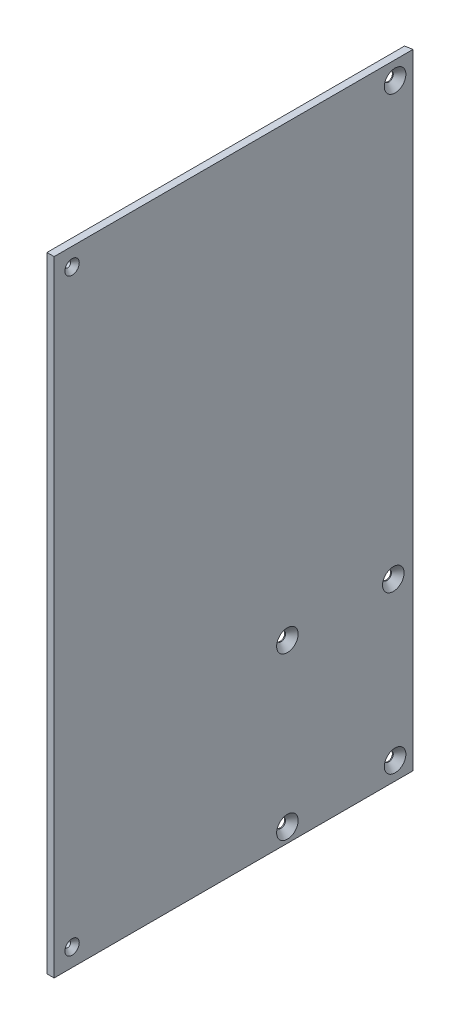
ISO-10303-21;
HEADER;
FILE_DESCRIPTION(('STEP AP214'),'2;1');
FILE_NAME('part.step','',(''),(''),'','','');
FILE_SCHEMA(('AUTOMOTIVE_DESIGN { 1 0 10303 214 1 1 1 1 }'));
ENDSEC;
DATA;
#1=APPLICATION_CONTEXT('core data for automotive mechanical design processes');
#2=APPLICATION_PROTOCOL_DEFINITION('international standard','automotive_design',2000,#1);
#3=PRODUCT_CONTEXT('',#1,'mechanical');
#4=PRODUCT('Part','Part','',(#3));
#5=PRODUCT_RELATED_PRODUCT_CATEGORY('part','',(#4));
#6=PRODUCT_DEFINITION_FORMATION('','',#4);
#7=PRODUCT_DEFINITION_CONTEXT('part definition',#1,'design');
#8=PRODUCT_DEFINITION('design','',#6,#7);
#9=PRODUCT_DEFINITION_SHAPE('','',#8);
#10=(LENGTH_UNIT() NAMED_UNIT(*) SI_UNIT(.MILLI.,.METRE.));
#11=(NAMED_UNIT(*) PLANE_ANGLE_UNIT() SI_UNIT($,.RADIAN.));
#12=(NAMED_UNIT(*) SI_UNIT($,.STERADIAN.) SOLID_ANGLE_UNIT());
#13=UNCERTAINTY_MEASURE_WITH_UNIT(LENGTH_MEASURE(1.E-05),#10,'distance_accuracy_value','');
#14=(GEOMETRIC_REPRESENTATION_CONTEXT(3) GLOBAL_UNCERTAINTY_ASSIGNED_CONTEXT((#13)) GLOBAL_UNIT_ASSIGNED_CONTEXT((#10,
#11,#12)) REPRESENTATION_CONTEXT('',''));
#15=CARTESIAN_POINT('',(0.,0.,0.));
#16=DIRECTION('',(0.,0.,1.));
#17=DIRECTION('',(1.,0.,0.));
#18=AXIS2_PLACEMENT_3D('',#15,#16,#17);
#19=CARTESIAN_POINT('',(82.9035305009001,0.,0.));
#20=DIRECTION('',(-1.,0.,0.));
#21=DIRECTION('',(0.,0.,1.));
#22=AXIS2_PLACEMENT_3D('',#19,#20,#21);
#23=PLANE('',#22);
#24=CARTESIAN_POINT('',(82.9035305009001,52.,44.9332950003212));
#25=DIRECTION('',(1.,0.,0.));
#26=DIRECTION('',(0.,0.,-1.));
#27=AXIS2_PLACEMENT_3D('',#24,#25,#26);
#28=CIRCLE('',#27,3.);
#29=CARTESIAN_POINT('',(82.9035305009001,52.,41.9332950003212));
#30=VERTEX_POINT('',#29);
#31=EDGE_CURVE('E155',#30,#30,#28,.T.);
#32=ORIENTED_EDGE('',*,*,#31,.F.);
#33=EDGE_LOOP('',(#32));
#34=FACE_BOUND('',#33,.T.);
#35=CARTESIAN_POINT('',(82.9035305009001,7.,74.4332950003211));
#36=DIRECTION('',(1.,0.,0.));
#37=DIRECTION('',(0.,0.,-1.));
#38=AXIS2_PLACEMENT_3D('',#35,#36,#37);
#39=CIRCLE('',#38,3.);
#40=CARTESIAN_POINT('',(82.9035305009001,7.,71.4332950003211));
#41=VERTEX_POINT('',#40);
#42=EDGE_CURVE('E146',#41,#41,#39,.T.);
#43=ORIENTED_EDGE('',*,*,#42,.F.);
#44=EDGE_LOOP('',(#43));
#45=FACE_BOUND('',#44,.T.);
#46=CARTESIAN_POINT('',(82.9035305009001,172.,44.4332950003212));
#47=DIRECTION('',(1.,0.,0.));
#48=DIRECTION('',(0.,0.,-1.));
#49=AXIS2_PLACEMENT_3D('',#46,#47,#48);
#50=CIRCLE('',#49,3.);
#51=CARTESIAN_POINT('',(82.9035305009001,172.,41.4332950003211));
#52=VERTEX_POINT('',#51);
#53=EDGE_CURVE('E141',#52,#52,#50,.T.);
#54=ORIENTED_EDGE('',*,*,#53,.F.);
#55=EDGE_LOOP('',(#54));
#56=FACE_BOUND('',#55,.T.);
#57=CARTESIAN_POINT('',(82.9035305009001,8.,44.4332950003212));
#58=DIRECTION('',(1.,0.,0.));
#59=DIRECTION('',(0.,0.,-1.));
#60=AXIS2_PLACEMENT_3D('',#57,#58,#59);
#61=CIRCLE('',#60,3.);
#62=CARTESIAN_POINT('',(82.9035305009001,8.,41.4332950003212));
#63=VERTEX_POINT('',#62);
#64=EDGE_CURVE('E136',#63,#63,#61,.T.);
#65=ORIENTED_EDGE('',*,*,#64,.F.);
#66=EDGE_LOOP('',(#65));
#67=FACE_BOUND('',#66,.T.);
#68=CARTESIAN_POINT('',(82.9035305009001,8.,134.399262949457));
#69=DIRECTION('',(1.,0.,0.));
#70=DIRECTION('',(0.,0.,-1.));
#71=AXIS2_PLACEMENT_3D('',#68,#69,#70);
#72=CIRCLE('',#71,2.);
#73=CARTESIAN_POINT('',(82.9035305009001,8.,132.399262949457));
#74=VERTEX_POINT('',#73);
#75=EDGE_CURVE('E124',#74,#74,#72,.T.);
#76=ORIENTED_EDGE('',*,*,#75,.F.);
#77=EDGE_LOOP('',(#76));
#78=FACE_BOUND('',#77,.T.);
#79=DIRECTION('',(0.,1.,0.));
#80=VECTOR('',#79,1.);
#81=CARTESIAN_POINT('',(82.9035305009001,177.,39.4332950003212));
#82=LINE('',#81,#80);
#83=CARTESIAN_POINT('',(82.9035305009001,3.,39.4332950003212));
#84=VERTEX_POINT('',#83);
#85=CARTESIAN_POINT('',(82.9035305009001,177.,39.4332950003212));
#86=VERTEX_POINT('',#85);
#87=EDGE_CURVE('E200',#84,#86,#82,.T.);
#88=ORIENTED_EDGE('',*,*,#87,.T.);
#89=DIRECTION('',(0.,0.,1.));
#90=VECTOR('',#89,1.);
#91=CARTESIAN_POINT('',(82.9035305009001,177.,39.4332950003212));
#92=LINE('',#91,#90);
#93=CARTESIAN_POINT('',(82.9035305009001,177.,139.399262949457));
#94=VERTEX_POINT('',#93);
#95=EDGE_CURVE('E98',#86,#94,#92,.T.);
#96=ORIENTED_EDGE('',*,*,#95,.T.);
#97=DIRECTION('',(0.,-1.,0.));
#98=VECTOR('',#97,1.);
#99=CARTESIAN_POINT('',(82.9035305009001,177.,139.399262949457));
#100=LINE('',#99,#98);
#101=CARTESIAN_POINT('',(82.9035305009001,3.,139.399262949457));
#102=VERTEX_POINT('',#101);
#103=EDGE_CURVE('E87',#94,#102,#100,.T.);
#104=ORIENTED_EDGE('',*,*,#103,.T.);
#105=DIRECTION('',(0.,0.,-1.));
#106=VECTOR('',#105,1.);
#107=CARTESIAN_POINT('',(82.9035305009001,3.,39.4332950003212));
#108=LINE('',#107,#106);
#109=EDGE_CURVE('E97',#102,#84,#108,.T.);
#110=ORIENTED_EDGE('',*,*,#109,.T.);
#111=EDGE_LOOP('',(#88,#96,#104,#110));
#112=FACE_BOUND('',#111,.T.);
#113=CARTESIAN_POINT('',(82.9035305009001,172.,134.399262949457));
#114=DIRECTION('',(1.,0.,0.));
#115=DIRECTION('',(0.,0.,-1.));
#116=AXIS2_PLACEMENT_3D('',#113,#114,#115);
#117=CIRCLE('',#116,2.);
#118=CARTESIAN_POINT('',(82.9035305009001,172.,132.399262949457));
#119=VERTEX_POINT('',#118);
#120=EDGE_CURVE('E130',#119,#119,#117,.T.);
#121=ORIENTED_EDGE('',*,*,#120,.F.);
#122=EDGE_LOOP('',(#121));
#123=FACE_BOUND('',#122,.T.);
#124=CARTESIAN_POINT('',(82.9035305009001,52.,74.4332950003211));
#125=DIRECTION('',(1.,0.,0.));
#126=DIRECTION('',(0.,0.,-1.));
#127=AXIS2_PLACEMENT_3D('',#124,#125,#126);
#128=CIRCLE('',#127,3.);
#129=CARTESIAN_POINT('',(82.9035305009001,52.,71.4332950003211));
#130=VERTEX_POINT('',#129);
#131=EDGE_CURVE('E422',#130,#130,#128,.T.);
#132=ORIENTED_EDGE('',*,*,#131,.F.);
#133=EDGE_LOOP('',(#132));
#134=FACE_BOUND('',#133,.T.);
#135=ADVANCED_FACE('F51',(#34,#45,#56,#67,#78,#112,#123,#134),#23,.F.);
#136=CARTESIAN_POINT('',(80.9035305009001,3.,39.4332950003212));
#137=DIRECTION('',(0.,-1.,0.));
#138=DIRECTION('',(0.,0.,-1.));
#139=AXIS2_PLACEMENT_3D('',#136,#137,#138);
#140=PLANE('',#139);
#141=DIRECTION('',(-0.983268675216208,0.,0.18216122622162));
#142=VECTOR('',#141,1.);
#143=CARTESIAN_POINT('',(80.9035305009001,3.,39.8038167728806));
#144=LINE('',#143,#142);
#145=CARTESIAN_POINT('',(80.9035305009001,3.,39.8038167728806));
#146=VERTEX_POINT('',#145);
#147=EDGE_CURVE('E104',#84,#146,#144,.T.);
#148=ORIENTED_EDGE('',*,*,#147,.F.);
#149=ORIENTED_EDGE('',*,*,#109,.F.);
#150=DIRECTION('',(1.,0.,0.));
#151=VECTOR('',#150,1.);
#152=CARTESIAN_POINT('',(80.9035305009001,3.,139.399262949457));
#153=LINE('',#152,#151);
#154=CARTESIAN_POINT('',(80.9035305009001,3.,139.399262949457));
#155=VERTEX_POINT('',#154);
#156=EDGE_CURVE('E11',#155,#102,#153,.T.);
#157=ORIENTED_EDGE('',*,*,#156,.F.);
#158=DIRECTION('',(0.,0.,-1.));
#159=VECTOR('',#158,1.);
#160=CARTESIAN_POINT('',(80.9035305009001,3.,39.4332950003212));
#161=LINE('',#160,#159);
#162=EDGE_CURVE('E114',#155,#146,#161,.T.);
#163=ORIENTED_EDGE('',*,*,#162,.T.);
#164=EDGE_LOOP('',(#148,#149,#157,#163));
#165=FACE_BOUND('',#164,.T.);
#166=ADVANCED_FACE('F102',(#165),#140,.T.);
#167=CARTESIAN_POINT('',(80.9035305009001,177.,139.399262949457));
#168=DIRECTION('',(0.,0.,1.));
#169=DIRECTION('',(1.,0.,0.));
#170=AXIS2_PLACEMENT_3D('',#167,#168,#169);
#171=PLANE('',#170);
#172=ORIENTED_EDGE('',*,*,#103,.F.);
#173=DIRECTION('',(1.,0.,0.));
#174=VECTOR('',#173,1.);
#175=CARTESIAN_POINT('',(80.9035305009001,177.,139.399262949457));
#176=LINE('',#175,#174);
#177=CARTESIAN_POINT('',(80.9035305009001,177.,139.399262949457));
#178=VERTEX_POINT('',#177);
#179=EDGE_CURVE('E62',#178,#94,#176,.T.);
#180=ORIENTED_EDGE('',*,*,#179,.F.);
#181=DIRECTION('',(0.,-1.,0.));
#182=VECTOR('',#181,1.);
#183=CARTESIAN_POINT('',(80.9035305009001,177.,139.399262949457));
#184=LINE('',#183,#182);
#185=EDGE_CURVE('E90',#178,#155,#184,.T.);
#186=ORIENTED_EDGE('',*,*,#185,.T.);
#187=ORIENTED_EDGE('',*,*,#156,.T.);
#188=EDGE_LOOP('',(#172,#180,#186,#187));
#189=FACE_BOUND('',#188,.T.);
#190=ADVANCED_FACE('F86',(#189),#171,.T.);
#191=CARTESIAN_POINT('',(80.9035305009001,177.,39.4332950003212));
#192=DIRECTION('',(0.,1.,0.));
#193=DIRECTION('',(0.,0.,1.));
#194=AXIS2_PLACEMENT_3D('',#191,#192,#193);
#195=PLANE('',#194);
#196=DIRECTION('',(-0.983268675216208,0.,0.18216122622162));
#197=VECTOR('',#196,1.);
#198=CARTESIAN_POINT('',(80.9035305009001,177.,39.8038167728806));
#199=LINE('',#198,#197);
#200=CARTESIAN_POINT('',(80.9035305009001,177.,39.8038167728806));
#201=VERTEX_POINT('',#200);
#202=EDGE_CURVE('E193',#86,#201,#199,.T.);
#203=ORIENTED_EDGE('',*,*,#202,.T.);
#204=DIRECTION('',(0.,0.,1.));
#205=VECTOR('',#204,1.);
#206=CARTESIAN_POINT('',(80.9035305009001,177.,39.4332950003212));
#207=LINE('',#206,#205);
#208=EDGE_CURVE('E106',#201,#178,#207,.T.);
#209=ORIENTED_EDGE('',*,*,#208,.T.);
#210=ORIENTED_EDGE('',*,*,#179,.T.);
#211=ORIENTED_EDGE('',*,*,#95,.F.);
#212=EDGE_LOOP('',(#203,#209,#210,#211));
#213=FACE_BOUND('',#212,.T.);
#214=ADVANCED_FACE('F53',(#213),#195,.T.);
#215=CARTESIAN_POINT('',(80.9035305009001,0.,0.));
#216=DIRECTION('',(-1.,0.,0.));
#217=DIRECTION('',(0.,0.,1.));
#218=AXIS2_PLACEMENT_3D('',#215,#216,#217);
#219=PLANE('',#218);
#220=CARTESIAN_POINT('',(80.9035305009001,52.,74.4332950003211));
#221=DIRECTION('',(-1.,0.,0.));
#222=DIRECTION('',(0.,0.,1.));
#223=AXIS2_PLACEMENT_3D('',#220,#221,#222);
#224=CIRCLE('',#223,1.24999999999999);
#225=CARTESIAN_POINT('',(80.9035305009001,52.,75.6832950003211));
#226=VERTEX_POINT('',#225);
#227=EDGE_CURVE('E55',#226,#226,#224,.T.);
#228=ORIENTED_EDGE('',*,*,#227,.F.);
#229=EDGE_LOOP('',(#228));
#230=FACE_BOUND('',#229,.T.);
#231=CARTESIAN_POINT('',(80.9035305009001,52.,44.9332950003212));
#232=DIRECTION('',(-1.,0.,0.));
#233=DIRECTION('',(0.,0.,1.));
#234=AXIS2_PLACEMENT_3D('',#231,#232,#233);
#235=CIRCLE('',#234,1.24999999999999);
#236=CARTESIAN_POINT('',(80.9035305009001,52.,46.1832950003211));
#237=VERTEX_POINT('',#236);
#238=EDGE_CURVE('E143',#237,#237,#235,.T.);
#239=ORIENTED_EDGE('',*,*,#238,.F.);
#240=EDGE_LOOP('',(#239));
#241=FACE_BOUND('',#240,.T.);
#242=CARTESIAN_POINT('',(80.9035305009001,7.,74.4332950003211));
#243=DIRECTION('',(-1.,0.,0.));
#244=DIRECTION('',(0.,0.,1.));
#245=AXIS2_PLACEMENT_3D('',#242,#243,#244);
#246=CIRCLE('',#245,1.24999999999999);
#247=CARTESIAN_POINT('',(80.9035305009001,7.,75.6832950003211));
#248=VERTEX_POINT('',#247);
#249=EDGE_CURVE('E138',#248,#248,#246,.T.);
#250=ORIENTED_EDGE('',*,*,#249,.F.);
#251=EDGE_LOOP('',(#250));
#252=FACE_BOUND('',#251,.T.);
#253=CARTESIAN_POINT('',(80.9035305009001,172.,44.4332950003212));
#254=DIRECTION('',(-1.,0.,0.));
#255=DIRECTION('',(0.,0.,1.));
#256=AXIS2_PLACEMENT_3D('',#253,#254,#255);
#257=CIRCLE('',#256,1.25);
#258=CARTESIAN_POINT('',(80.9035305009001,172.,45.6832950003212));
#259=VERTEX_POINT('',#258);
#260=EDGE_CURVE('E132',#259,#259,#257,.T.);
#261=ORIENTED_EDGE('',*,*,#260,.F.);
#262=EDGE_LOOP('',(#261));
#263=FACE_BOUND('',#262,.T.);
#264=CARTESIAN_POINT('',(80.9035305009001,8.,44.4332950003212));
#265=DIRECTION('',(-1.,0.,0.));
#266=DIRECTION('',(0.,0.,1.));
#267=AXIS2_PLACEMENT_3D('',#264,#265,#266);
#268=CIRCLE('',#267,1.25);
#269=CARTESIAN_POINT('',(80.9035305009001,8.,45.6832950003211));
#270=VERTEX_POINT('',#269);
#271=EDGE_CURVE('E126',#270,#270,#268,.T.);
#272=ORIENTED_EDGE('',*,*,#271,.F.);
#273=EDGE_LOOP('',(#272));
#274=FACE_BOUND('',#273,.T.);
#275=CARTESIAN_POINT('',(80.9035305009001,172.,134.399262949457));
#276=DIRECTION('',(-1.,0.,0.));
#277=DIRECTION('',(0.,0.,1.));
#278=AXIS2_PLACEMENT_3D('',#275,#276,#277);
#279=CIRCLE('',#278,0.799999999999995);
#280=CARTESIAN_POINT('',(80.9035305009001,172.,135.199262949457));
#281=VERTEX_POINT('',#280);
#282=EDGE_CURVE('E120',#281,#281,#279,.T.);
#283=ORIENTED_EDGE('',*,*,#282,.F.);
#284=EDGE_LOOP('',(#283));
#285=FACE_BOUND('',#284,.T.);
#286=CARTESIAN_POINT('',(80.9035305009001,8.,134.399262949457));
#287=DIRECTION('',(-1.,0.,0.));
#288=DIRECTION('',(0.,0.,1.));
#289=AXIS2_PLACEMENT_3D('',#286,#287,#288);
#290=CIRCLE('',#289,0.8);
#291=CARTESIAN_POINT('',(80.9035305009001,8.,135.199262949457));
#292=VERTEX_POINT('',#291);
#293=EDGE_CURVE('E115',#292,#292,#290,.T.);
#294=ORIENTED_EDGE('',*,*,#293,.F.);
#295=EDGE_LOOP('',(#294));
#296=FACE_BOUND('',#295,.T.);
#297=DIRECTION('',(0.,-1.,0.));
#298=VECTOR('',#297,1.);
#299=CARTESIAN_POINT('',(80.9035305009001,179.034032050864,39.8038167728806));
#300=LINE('',#299,#298);
#301=EDGE_CURVE('E197',#201,#146,#300,.T.);
#302=ORIENTED_EDGE('',*,*,#301,.T.);
#303=ORIENTED_EDGE('',*,*,#162,.F.);
#304=ORIENTED_EDGE('',*,*,#185,.F.);
#305=ORIENTED_EDGE('',*,*,#208,.F.);
#306=EDGE_LOOP('',(#302,#303,#304,#305));
#307=FACE_BOUND('',#306,.T.);
#308=ADVANCED_FACE('F217',(#230,#241,#252,#263,#274,#285,#296,#307),#219,.T.);
#309=CARTESIAN_POINT('',(80.9035305009001,179.034032050864,39.8038167728806));
#310=DIRECTION('',(0.182161226221619,0.,0.983268675216208));
#311=DIRECTION('',(0.983268675216208,0.,-0.18216122622162));
#312=AXIS2_PLACEMENT_3D('',#309,#310,#311);
#313=PLANE('',#312);
#314=ORIENTED_EDGE('',*,*,#87,.F.);
#315=ORIENTED_EDGE('',*,*,#147,.T.);
#316=ORIENTED_EDGE('',*,*,#301,.F.);
#317=ORIENTED_EDGE('',*,*,#202,.F.);
#318=EDGE_LOOP('',(#314,#315,#316,#317));
#319=FACE_BOUND('',#318,.T.);
#320=ADVANCED_FACE('F210',(#319),#313,.F.);
#321=CARTESIAN_POINT('',(82.9035305009001,8.,134.399262949457));
#322=DIRECTION('',(1.,0.,0.));
#323=DIRECTION('',(0.,0.,-1.));
#324=AXIS2_PLACEMENT_3D('',#321,#322,#323);
#325=CYLINDRICAL_SURFACE('',#324,0.8);
#326=ORIENTED_EDGE('',*,*,#293,.T.);
#327=EDGE_LOOP('',(#326));
#328=FACE_BOUND('',#327,.T.);
#329=CARTESIAN_POINT('',(81.7035305009001,8.,134.399262949457));
#330=DIRECTION('',(1.,0.,0.));
#331=DIRECTION('',(0.,0.,-1.));
#332=AXIS2_PLACEMENT_3D('',#329,#330,#331);
#333=CIRCLE('',#332,0.8);
#334=CARTESIAN_POINT('',(81.7035305009001,8.,133.599262949457));
#335=VERTEX_POINT('',#334);
#336=EDGE_CURVE('E119',#335,#335,#333,.T.);
#337=ORIENTED_EDGE('',*,*,#336,.T.);
#338=EDGE_LOOP('',(#337));
#339=FACE_BOUND('',#338,.T.);
#340=ADVANCED_FACE('F226',(#328,#339),#325,.F.);
#341=CARTESIAN_POINT('',(82.9035305009001,8.,134.399262949457));
#342=DIRECTION('',(1.,0.,0.));
#343=DIRECTION('',(0.,0.,-1.));
#344=AXIS2_PLACEMENT_3D('',#341,#342,#343);
#345=CONICAL_SURFACE('',#344,2.,0.785398163397445);
#346=ORIENTED_EDGE('',*,*,#336,.F.);
#347=EDGE_LOOP('',(#346));
#348=FACE_BOUND('',#347,.T.);
#349=ORIENTED_EDGE('',*,*,#75,.T.);
#350=EDGE_LOOP('',(#349));
#351=FACE_BOUND('',#350,.T.);
#352=ADVANCED_FACE('F267',(#348,#351),#345,.F.);
#353=CARTESIAN_POINT('',(82.9035305009001,172.,134.399262949457));
#354=DIRECTION('',(1.,0.,0.));
#355=DIRECTION('',(0.,0.,-1.));
#356=AXIS2_PLACEMENT_3D('',#353,#354,#355);
#357=CYLINDRICAL_SURFACE('',#356,0.799999999999995);
#358=ORIENTED_EDGE('',*,*,#282,.T.);
#359=EDGE_LOOP('',(#358));
#360=FACE_BOUND('',#359,.T.);
#361=CARTESIAN_POINT('',(81.7035305009001,172.,134.399262949457));
#362=DIRECTION('',(1.,0.,0.));
#363=DIRECTION('',(0.,0.,-1.));
#364=AXIS2_PLACEMENT_3D('',#361,#362,#363);
#365=CIRCLE('',#364,0.799999999999995);
#366=CARTESIAN_POINT('',(81.7035305009001,172.,133.599262949457));
#367=VERTEX_POINT('',#366);
#368=EDGE_CURVE('E125',#367,#367,#365,.T.);
#369=ORIENTED_EDGE('',*,*,#368,.T.);
#370=EDGE_LOOP('',(#369));
#371=FACE_BOUND('',#370,.T.);
#372=ADVANCED_FACE('F279',(#360,#371),#357,.F.);
#373=CARTESIAN_POINT('',(82.9035305009001,172.,134.399262949457));
#374=DIRECTION('',(1.,0.,0.));
#375=DIRECTION('',(0.,0.,-1.));
#376=AXIS2_PLACEMENT_3D('',#373,#374,#375);
#377=CONICAL_SURFACE('',#376,2.,0.785398163397448);
#378=ORIENTED_EDGE('',*,*,#368,.F.);
#379=EDGE_LOOP('',(#378));
#380=FACE_BOUND('',#379,.T.);
#381=ORIENTED_EDGE('',*,*,#120,.T.);
#382=EDGE_LOOP('',(#381));
#383=FACE_BOUND('',#382,.T.);
#384=ADVANCED_FACE('F289',(#380,#383),#377,.F.);
#385=CARTESIAN_POINT('',(82.9035305009001,8.,44.4332950003212));
#386=DIRECTION('',(1.,0.,0.));
#387=DIRECTION('',(0.,0.,-1.));
#388=AXIS2_PLACEMENT_3D('',#385,#386,#387);
#389=CYLINDRICAL_SURFACE('',#388,1.25);
#390=ORIENTED_EDGE('',*,*,#271,.T.);
#391=EDGE_LOOP('',(#390));
#392=FACE_BOUND('',#391,.T.);
#393=CARTESIAN_POINT('',(81.1535305009001,8.,44.4332950003212));
#394=DIRECTION('',(1.,0.,0.));
#395=DIRECTION('',(0.,0.,-1.));
#396=AXIS2_PLACEMENT_3D('',#393,#394,#395);
#397=CIRCLE('',#396,1.25);
#398=CARTESIAN_POINT('',(81.1535305009001,8.,43.1832950003212));
#399=VERTEX_POINT('',#398);
#400=EDGE_CURVE('E131',#399,#399,#397,.T.);
#401=ORIENTED_EDGE('',*,*,#400,.T.);
#402=EDGE_LOOP('',(#401));
#403=FACE_BOUND('',#402,.T.);
#404=ADVANCED_FACE('F301',(#392,#403),#389,.F.);
#405=CARTESIAN_POINT('',(82.9035305009001,8.,44.4332950003212));
#406=DIRECTION('',(1.,0.,0.));
#407=DIRECTION('',(0.,0.,-1.));
#408=AXIS2_PLACEMENT_3D('',#405,#406,#407);
#409=CONICAL_SURFACE('',#408,3.,0.785398163397448);
#410=ORIENTED_EDGE('',*,*,#400,.F.);
#411=EDGE_LOOP('',(#410));
#412=FACE_BOUND('',#411,.T.);
#413=ORIENTED_EDGE('',*,*,#64,.T.);
#414=EDGE_LOOP('',(#413));
#415=FACE_BOUND('',#414,.T.);
#416=ADVANCED_FACE('F311',(#412,#415),#409,.F.);
#417=CARTESIAN_POINT('',(82.9035305009001,172.,44.4332950003212));
#418=DIRECTION('',(1.,0.,0.));
#419=DIRECTION('',(0.,0.,-1.));
#420=AXIS2_PLACEMENT_3D('',#417,#418,#419);
#421=CYLINDRICAL_SURFACE('',#420,1.25);
#422=ORIENTED_EDGE('',*,*,#260,.T.);
#423=EDGE_LOOP('',(#422));
#424=FACE_BOUND('',#423,.T.);
#425=CARTESIAN_POINT('',(81.1535305009001,172.,44.4332950003212));
#426=DIRECTION('',(1.,0.,0.));
#427=DIRECTION('',(0.,0.,-1.));
#428=AXIS2_PLACEMENT_3D('',#425,#426,#427);
#429=CIRCLE('',#428,1.25);
#430=CARTESIAN_POINT('',(81.1535305009001,172.,43.1832950003212));
#431=VERTEX_POINT('',#430);
#432=EDGE_CURVE('E137',#431,#431,#429,.T.);
#433=ORIENTED_EDGE('',*,*,#432,.T.);
#434=EDGE_LOOP('',(#433));
#435=FACE_BOUND('',#434,.T.);
#436=ADVANCED_FACE('F323',(#424,#435),#421,.F.);
#437=CARTESIAN_POINT('',(82.9035305009001,172.,44.4332950003212));
#438=DIRECTION('',(1.,0.,0.));
#439=DIRECTION('',(0.,0.,-1.));
#440=AXIS2_PLACEMENT_3D('',#437,#438,#439);
#441=CONICAL_SURFACE('',#440,3.,0.785398163397448);
#442=ORIENTED_EDGE('',*,*,#432,.F.);
#443=EDGE_LOOP('',(#442));
#444=FACE_BOUND('',#443,.T.);
#445=ORIENTED_EDGE('',*,*,#53,.T.);
#446=EDGE_LOOP('',(#445));
#447=FACE_BOUND('',#446,.T.);
#448=ADVANCED_FACE('F332',(#444,#447),#441,.F.);
#449=CARTESIAN_POINT('',(82.9035305009001,7.,74.4332950003211));
#450=DIRECTION('',(1.,0.,0.));
#451=DIRECTION('',(0.,0.,-1.));
#452=AXIS2_PLACEMENT_3D('',#449,#450,#451);
#453=CYLINDRICAL_SURFACE('',#452,1.24999999999999);
#454=ORIENTED_EDGE('',*,*,#249,.T.);
#455=EDGE_LOOP('',(#454));
#456=FACE_BOUND('',#455,.T.);
#457=CARTESIAN_POINT('',(81.1535305009001,7.,74.4332950003211));
#458=DIRECTION('',(1.,0.,0.));
#459=DIRECTION('',(0.,0.,-1.));
#460=AXIS2_PLACEMENT_3D('',#457,#458,#459);
#461=CIRCLE('',#460,1.24999999999999);
#462=CARTESIAN_POINT('',(81.1535305009001,7.,73.1832950003212));
#463=VERTEX_POINT('',#462);
#464=EDGE_CURVE('E142',#463,#463,#461,.T.);
#465=ORIENTED_EDGE('',*,*,#464,.T.);
#466=EDGE_LOOP('',(#465));
#467=FACE_BOUND('',#466,.T.);
#468=ADVANCED_FACE('F343',(#456,#467),#453,.F.);
#469=CARTESIAN_POINT('',(82.9035305009001,7.,74.4332950003211));
#470=DIRECTION('',(1.,0.,0.));
#471=DIRECTION('',(0.,0.,-1.));
#472=AXIS2_PLACEMENT_3D('',#469,#470,#471);
#473=CONICAL_SURFACE('',#472,3.,0.785398163397443);
#474=ORIENTED_EDGE('',*,*,#464,.F.);
#475=EDGE_LOOP('',(#474));
#476=FACE_BOUND('',#475,.T.);
#477=ORIENTED_EDGE('',*,*,#42,.T.);
#478=EDGE_LOOP('',(#477));
#479=FACE_BOUND('',#478,.T.);
#480=ADVANCED_FACE('F360',(#476,#479),#473,.F.);
#481=CARTESIAN_POINT('',(82.9035305009001,52.,44.9332950003212));
#482=DIRECTION('',(1.,0.,0.));
#483=DIRECTION('',(0.,0.,-1.));
#484=AXIS2_PLACEMENT_3D('',#481,#482,#483);
#485=CYLINDRICAL_SURFACE('',#484,1.24999999999999);
#486=ORIENTED_EDGE('',*,*,#238,.T.);
#487=EDGE_LOOP('',(#486));
#488=FACE_BOUND('',#487,.T.);
#489=CARTESIAN_POINT('',(81.1535305009001,52.,44.9332950003212));
#490=DIRECTION('',(1.,0.,0.));
#491=DIRECTION('',(0.,0.,-1.));
#492=AXIS2_PLACEMENT_3D('',#489,#490,#491);
#493=CIRCLE('',#492,1.24999999999999);
#494=CARTESIAN_POINT('',(81.1535305009001,52.,43.6832950003212));
#495=VERTEX_POINT('',#494);
#496=EDGE_CURVE('E147',#495,#495,#493,.T.);
#497=ORIENTED_EDGE('',*,*,#496,.T.);
#498=EDGE_LOOP('',(#497));
#499=FACE_BOUND('',#498,.T.);
#500=ADVANCED_FACE('F370',(#488,#499),#485,.F.);
#501=CARTESIAN_POINT('',(82.9035305009001,52.,44.9332950003212));
#502=DIRECTION('',(1.,0.,0.));
#503=DIRECTION('',(0.,0.,-1.));
#504=AXIS2_PLACEMENT_3D('',#501,#502,#503);
#505=CONICAL_SURFACE('',#504,3.,0.785398163397442);
#506=ORIENTED_EDGE('',*,*,#496,.F.);
#507=EDGE_LOOP('',(#506));
#508=FACE_BOUND('',#507,.T.);
#509=ORIENTED_EDGE('',*,*,#31,.T.);
#510=EDGE_LOOP('',(#509));
#511=FACE_BOUND('',#510,.T.);
#512=ADVANCED_FACE('F381',(#508,#511),#505,.F.);
#513=CARTESIAN_POINT('',(82.9035305009001,52.,74.4332950003211));
#514=DIRECTION('',(1.,0.,0.));
#515=DIRECTION('',(0.,0.,-1.));
#516=AXIS2_PLACEMENT_3D('',#513,#514,#515);
#517=CYLINDRICAL_SURFACE('',#516,1.24999999999999);
#518=ORIENTED_EDGE('',*,*,#227,.T.);
#519=EDGE_LOOP('',(#518));
#520=FACE_BOUND('',#519,.T.);
#521=CARTESIAN_POINT('',(81.1535305009001,52.,74.4332950003211));
#522=DIRECTION('',(1.,0.,0.));
#523=DIRECTION('',(0.,0.,-1.));
#524=AXIS2_PLACEMENT_3D('',#521,#522,#523);
#525=CIRCLE('',#524,1.24999999999999);
#526=CARTESIAN_POINT('',(81.1535305009001,52.,73.1832950003212));
#527=VERTEX_POINT('',#526);
#528=EDGE_CURVE('E419',#527,#527,#525,.T.);
#529=ORIENTED_EDGE('',*,*,#528,.T.);
#530=EDGE_LOOP('',(#529));
#531=FACE_BOUND('',#530,.T.);
#532=ADVANCED_FACE('F391',(#520,#531),#517,.F.);
#533=CARTESIAN_POINT('',(82.9035305009001,52.,74.4332950003211));
#534=DIRECTION('',(1.,0.,0.));
#535=DIRECTION('',(0.,0.,-1.));
#536=AXIS2_PLACEMENT_3D('',#533,#534,#535);
#537=CONICAL_SURFACE('',#536,3.,0.785398163397445);
#538=ORIENTED_EDGE('',*,*,#528,.F.);
#539=EDGE_LOOP('',(#538));
#540=FACE_BOUND('',#539,.T.);
#541=ORIENTED_EDGE('',*,*,#131,.T.);
#542=EDGE_LOOP('',(#541));
#543=FACE_BOUND('',#542,.T.);
#544=ADVANCED_FACE('F402',(#540,#543),#537,.F.);
#545=CLOSED_SHELL('',(#135,#166,#190,#214,#308,#320,#340,#352,#372,#384,#404,#416,#436,#448,
#468,#480,#500,#512,#532,#544));
#546=MANIFOLD_SOLID_BREP('B2',#545);
#547=ADVANCED_BREP_SHAPE_REPRESENTATION('',(#18,#546),#14);
#548=SHAPE_DEFINITION_REPRESENTATION(#9,#547);
ENDSEC;
END-ISO-10303-21;
